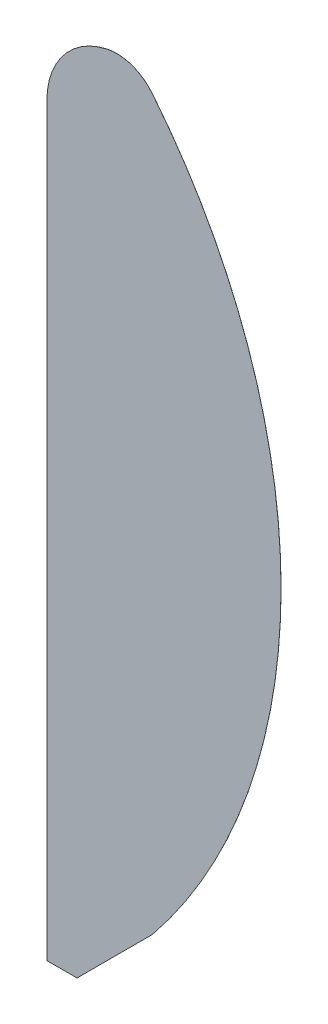
ISO-10303-21;
HEADER;
FILE_DESCRIPTION(('STEP AP214'),'2;1');
FILE_NAME('part.step','',(''),(''),'','','');
FILE_SCHEMA(('AUTOMOTIVE_DESIGN { 1 0 10303 214 1 1 1 1 }'));
ENDSEC;
DATA;
#1=APPLICATION_CONTEXT('core data for automotive mechanical design processes');
#2=APPLICATION_PROTOCOL_DEFINITION('international standard','automotive_design',2000,#1);
#3=PRODUCT_CONTEXT('',#1,'mechanical');
#4=PRODUCT('Part','Part','',(#3));
#5=PRODUCT_RELATED_PRODUCT_CATEGORY('part','',(#4));
#6=PRODUCT_DEFINITION_FORMATION('','',#4);
#7=PRODUCT_DEFINITION_CONTEXT('part definition',#1,'design');
#8=PRODUCT_DEFINITION('design','',#6,#7);
#9=PRODUCT_DEFINITION_SHAPE('','',#8);
#10=(LENGTH_UNIT() NAMED_UNIT(*) SI_UNIT(.MILLI.,.METRE.));
#11=(NAMED_UNIT(*) PLANE_ANGLE_UNIT() SI_UNIT($,.RADIAN.));
#12=(NAMED_UNIT(*) SI_UNIT($,.STERADIAN.) SOLID_ANGLE_UNIT());
#13=UNCERTAINTY_MEASURE_WITH_UNIT(LENGTH_MEASURE(1.E-05),#10,'distance_accuracy_value','');
#14=(GEOMETRIC_REPRESENTATION_CONTEXT(3) GLOBAL_UNCERTAINTY_ASSIGNED_CONTEXT((#13)) GLOBAL_UNIT_ASSIGNED_CONTEXT((#10,
#11,#12)) REPRESENTATION_CONTEXT('',''));
#15=CARTESIAN_POINT('',(0.,0.,0.));
#16=DIRECTION('',(0.,0.,1.));
#17=DIRECTION('',(1.,0.,0.));
#18=AXIS2_PLACEMENT_3D('',#15,#16,#17);
#19=CARTESIAN_POINT('',(0.,0.,0.01));
#20=DIRECTION('',(0.,1.,0.));
#21=DIRECTION('',(-1.,0.,0.));
#22=AXIS2_PLACEMENT_3D('',#19,#20,#21);
#23=PLANE('',#22);
#24=DIRECTION('',(1.,0.,0.));
#25=VECTOR('',#24,1.);
#26=CARTESIAN_POINT('',(0.,0.,0.));
#27=LINE('',#26,#25);
#28=CARTESIAN_POINT('',(0.,0.,0.));
#29=VERTEX_POINT('',#28);
#30=CARTESIAN_POINT('',(5.,0.,0.));
#31=VERTEX_POINT('',#30);
#32=EDGE_CURVE('E122',#29,#31,#27,.T.);
#33=ORIENTED_EDGE('',*,*,#32,.T.);
#34=DIRECTION('',(0.,0.,-1.));
#35=VECTOR('',#34,1.);
#36=CARTESIAN_POINT('',(5.,0.,0.01));
#37=LINE('',#36,#35);
#38=CARTESIAN_POINT('',(5.,0.,0.01));
#39=VERTEX_POINT('',#38);
#40=EDGE_CURVE('E11',#39,#31,#37,.T.);
#41=ORIENTED_EDGE('',*,*,#40,.F.);
#42=DIRECTION('',(1.,0.,0.));
#43=VECTOR('',#42,1.);
#44=CARTESIAN_POINT('',(0.,0.,0.01));
#45=LINE('',#44,#43);
#46=CARTESIAN_POINT('',(0.,0.,0.01));
#47=VERTEX_POINT('',#46);
#48=EDGE_CURVE('E136',#47,#39,#45,.T.);
#49=ORIENTED_EDGE('',*,*,#48,.F.);
#50=DIRECTION('',(0.,0.,-1.));
#51=VECTOR('',#50,1.);
#52=CARTESIAN_POINT('',(0.,0.,0.01));
#53=LINE('',#52,#51);
#54=EDGE_CURVE('E54',#47,#29,#53,.T.);
#55=ORIENTED_EDGE('',*,*,#54,.T.);
#56=EDGE_LOOP('',(#33,#41,#49,#55));
#57=FACE_BOUND('',#56,.T.);
#58=ADVANCED_FACE('F39',(#57),#23,.F.);
#59=CARTESIAN_POINT('',(5.,0.,0.01));
#60=DIRECTION('',(-0.707106781186547,0.707106781186547,0.));
#61=DIRECTION('',(-0.707106781186548,-0.707106781186548,0.));
#62=AXIS2_PLACEMENT_3D('',#59,#60,#61);
#63=PLANE('',#62);
#64=DIRECTION('',(0.707106781186547,0.707106781186547,0.));
#65=VECTOR('',#64,1.);
#66=CARTESIAN_POINT('',(5.,0.,0.));
#67=LINE('',#66,#65);
#68=CARTESIAN_POINT('',(17.5,12.5,0.));
#69=VERTEX_POINT('',#68);
#70=EDGE_CURVE('E124',#31,#69,#67,.T.);
#71=ORIENTED_EDGE('',*,*,#70,.T.);
#72=DIRECTION('',(0.,0.,-1.));
#73=VECTOR('',#72,1.);
#74=CARTESIAN_POINT('',(17.5,12.5,0.01));
#75=LINE('',#74,#73);
#76=CARTESIAN_POINT('',(17.5,12.5,0.01));
#77=VERTEX_POINT('',#76);
#78=EDGE_CURVE('E50',#77,#69,#75,.T.);
#79=ORIENTED_EDGE('',*,*,#78,.F.);
#80=DIRECTION('',(0.707106781186547,0.707106781186547,0.));
#81=VECTOR('',#80,1.);
#82=CARTESIAN_POINT('',(5.,0.,0.01));
#83=LINE('',#82,#81);
#84=EDGE_CURVE('E87',#39,#77,#83,.T.);
#85=ORIENTED_EDGE('',*,*,#84,.F.);
#86=ORIENTED_EDGE('',*,*,#40,.T.);
#87=EDGE_LOOP('',(#71,#79,#85,#86));
#88=FACE_BOUND('',#87,.T.);
#89=ADVANCED_FACE('F156',(#88),#63,.F.);
#90=CARTESIAN_POINT('',(-57.2979556482088,72.9240746674905,0.01));
#91=DIRECTION('',(0.,0.,-1.));
#92=DIRECTION('',(-1.,0.,0.));
#93=AXIS2_PLACEMENT_3D('',#90,#91,#92);
#94=CYLINDRICAL_SURFACE('',#93,96.1550985053516);
#95=CARTESIAN_POINT('',(-57.2979556482088,72.9240746674905,0.));
#96=DIRECTION('',(0.,0.,1.));
#97=DIRECTION('',(1.,0.,0.));
#98=AXIS2_PLACEMENT_3D('',#95,#96,#97);
#99=CIRCLE('',#98,96.1550985053516);
#100=CARTESIAN_POINT('',(17.5,133.348149334981,0.));
#101=VERTEX_POINT('',#100);
#102=EDGE_CURVE('E130',#69,#101,#99,.T.);
#103=ORIENTED_EDGE('',*,*,#102,.T.);
#104=DIRECTION('',(0.,0.,-1.));
#105=VECTOR('',#104,1.);
#106=CARTESIAN_POINT('',(17.5,133.348149334981,0.01));
#107=LINE('',#106,#105);
#108=CARTESIAN_POINT('',(17.5,133.348149334981,0.01));
#109=VERTEX_POINT('',#108);
#110=EDGE_CURVE('E106',#109,#101,#107,.T.);
#111=ORIENTED_EDGE('',*,*,#110,.F.);
#112=CARTESIAN_POINT('',(-57.2979556482088,72.9240746674905,0.01));
#113=DIRECTION('',(0.,0.,1.));
#114=DIRECTION('',(1.,0.,0.));
#115=AXIS2_PLACEMENT_3D('',#112,#113,#114);
#116=CIRCLE('',#115,96.1550985053516);
#117=EDGE_CURVE('E111',#77,#109,#116,.T.);
#118=ORIENTED_EDGE('',*,*,#117,.F.);
#119=ORIENTED_EDGE('',*,*,#78,.T.);
#120=EDGE_LOOP('',(#103,#111,#118,#119));
#121=FACE_BOUND('',#120,.T.);
#122=ADVANCED_FACE('F142',(#121),#94,.T.);
#123=CARTESIAN_POINT('',(11.5943245850789,128.577364236101,0.01));
#124=DIRECTION('',(0.,0.,-1.));
#125=DIRECTION('',(-1.,0.,0.));
#126=AXIS2_PLACEMENT_3D('',#123,#124,#125);
#127=CYLINDRICAL_SURFACE('',#126,7.59192943632236);
#128=CARTESIAN_POINT('',(11.5943245850789,128.577364236101,0.));
#129=DIRECTION('',(0.,0.,-1.));
#130=DIRECTION('',(-1.,0.,0.));
#131=AXIS2_PLACEMENT_3D('',#128,#129,#130);
#132=CIRCLE('',#131,7.59192943632236);
#133=CARTESIAN_POINT('',(10.,136.,0.));
#134=VERTEX_POINT('',#133);
#135=EDGE_CURVE('E105',#134,#101,#132,.T.);
#136=ORIENTED_EDGE('',*,*,#135,.F.);
#137=DIRECTION('',(0.,0.,-1.));
#138=VECTOR('',#137,1.);
#139=CARTESIAN_POINT('',(10.,136.,0.01));
#140=LINE('',#139,#138);
#141=CARTESIAN_POINT('',(10.,136.,0.01));
#142=VERTEX_POINT('',#141);
#143=EDGE_CURVE('E100',#142,#134,#140,.T.);
#144=ORIENTED_EDGE('',*,*,#143,.F.);
#145=CARTESIAN_POINT('',(11.5943245850789,128.577364236101,0.01));
#146=DIRECTION('',(0.,0.,-1.));
#147=DIRECTION('',(-1.,0.,0.));
#148=AXIS2_PLACEMENT_3D('',#145,#146,#147);
#149=CIRCLE('',#148,7.59192943632236);
#150=EDGE_CURVE('E99',#142,#109,#149,.T.);
#151=ORIENTED_EDGE('',*,*,#150,.T.);
#152=ORIENTED_EDGE('',*,*,#110,.T.);
#153=EDGE_LOOP('',(#136,#144,#151,#152));
#154=FACE_BOUND('',#153,.T.);
#155=ADVANCED_FACE('F97',(#154),#127,.T.);
#156=CARTESIAN_POINT('',(12.6582688,123.624,0.01));
#157=DIRECTION('',(0.,0.,-1.));
#158=DIRECTION('',(-1.,0.,0.));
#159=AXIS2_PLACEMENT_3D('',#156,#157,#158);
#160=CYLINDRICAL_SURFACE('',#159,12.6582688);
#161=CARTESIAN_POINT('',(12.6582688,123.624,0.));
#162=DIRECTION('',(0.,0.,-1.));
#163=DIRECTION('',(-1.,0.,0.));
#164=AXIS2_PLACEMENT_3D('',#161,#162,#163);
#165=CIRCLE('',#164,12.6582688);
#166=CARTESIAN_POINT('',(0.,123.624,0.));
#167=VERTEX_POINT('',#166);
#168=EDGE_CURVE('E134',#167,#134,#165,.T.);
#169=ORIENTED_EDGE('',*,*,#168,.F.);
#170=DIRECTION('',(0.,0.,-1.));
#171=VECTOR('',#170,1.);
#172=CARTESIAN_POINT('',(0.,123.624,0.01));
#173=LINE('',#172,#171);
#174=CARTESIAN_POINT('',(0.,123.624,0.01));
#175=VERTEX_POINT('',#174);
#176=EDGE_CURVE('E73',#175,#167,#173,.T.);
#177=ORIENTED_EDGE('',*,*,#176,.F.);
#178=CARTESIAN_POINT('',(12.6582688,123.624,0.01));
#179=DIRECTION('',(0.,0.,-1.));
#180=DIRECTION('',(-1.,0.,0.));
#181=AXIS2_PLACEMENT_3D('',#178,#179,#180);
#182=CIRCLE('',#181,12.6582688);
#183=EDGE_CURVE('E115',#175,#142,#182,.T.);
#184=ORIENTED_EDGE('',*,*,#183,.T.);
#185=ORIENTED_EDGE('',*,*,#143,.T.);
#186=EDGE_LOOP('',(#169,#177,#184,#185));
#187=FACE_BOUND('',#186,.T.);
#188=ADVANCED_FACE('F116',(#187),#160,.T.);
#189=CARTESIAN_POINT('',(0.,0.,0.01));
#190=DIRECTION('',(-1.,0.,0.));
#191=DIRECTION('',(0.,-1.,0.));
#192=AXIS2_PLACEMENT_3D('',#189,#190,#191);
#193=PLANE('',#192);
#194=DIRECTION('',(0.,1.,0.));
#195=VECTOR('',#194,1.);
#196=CARTESIAN_POINT('',(0.,0.,0.));
#197=LINE('',#196,#195);
#198=EDGE_CURVE('E135',#29,#167,#197,.T.);
#199=ORIENTED_EDGE('',*,*,#198,.F.);
#200=ORIENTED_EDGE('',*,*,#54,.F.);
#201=DIRECTION('',(0.,1.,0.));
#202=VECTOR('',#201,1.);
#203=CARTESIAN_POINT('',(0.,0.,0.01));
#204=LINE('',#203,#202);
#205=EDGE_CURVE('E120',#47,#175,#204,.T.);
#206=ORIENTED_EDGE('',*,*,#205,.T.);
#207=ORIENTED_EDGE('',*,*,#176,.T.);
#208=EDGE_LOOP('',(#199,#200,#206,#207));
#209=FACE_BOUND('',#208,.T.);
#210=ADVANCED_FACE('F144',(#209),#193,.T.);
#211=CARTESIAN_POINT('',(-57.2979556482088,72.9240746674905,0.01));
#212=DIRECTION('',(0.,0.,1.));
#213=DIRECTION('',(1.,0.,0.));
#214=AXIS2_PLACEMENT_3D('',#211,#212,#213);
#215=PLANE('',#214);
#216=ORIENTED_EDGE('',*,*,#48,.T.);
#217=ORIENTED_EDGE('',*,*,#84,.T.);
#218=ORIENTED_EDGE('',*,*,#117,.T.);
#219=ORIENTED_EDGE('',*,*,#150,.F.);
#220=ORIENTED_EDGE('',*,*,#183,.F.);
#221=ORIENTED_EDGE('',*,*,#205,.F.);
#222=EDGE_LOOP('',(#216,#217,#218,#219,#220,#221));
#223=FACE_BOUND('',#222,.T.);
#224=ADVANCED_FACE('F109',(#223),#215,.T.);
#225=CARTESIAN_POINT('',(-57.2979556482088,72.9240746674905,0.));
#226=DIRECTION('',(0.,0.,1.));
#227=DIRECTION('',(1.,0.,0.));
#228=AXIS2_PLACEMENT_3D('',#225,#226,#227);
#229=PLANE('',#228);
#230=ORIENTED_EDGE('',*,*,#32,.F.);
#231=ORIENTED_EDGE('',*,*,#198,.T.);
#232=ORIENTED_EDGE('',*,*,#168,.T.);
#233=ORIENTED_EDGE('',*,*,#135,.T.);
#234=ORIENTED_EDGE('',*,*,#102,.F.);
#235=ORIENTED_EDGE('',*,*,#70,.F.);
#236=EDGE_LOOP('',(#230,#231,#232,#233,#234,#235));
#237=FACE_BOUND('',#236,.T.);
#238=ADVANCED_FACE('F145',(#237),#229,.F.);
#239=CLOSED_SHELL('',(#58,#89,#122,#155,#188,#210,#224,#238));
#240=MANIFOLD_SOLID_BREP('B2',#239);
#241=ADVANCED_BREP_SHAPE_REPRESENTATION('',(#18,#240),#14);
#242=SHAPE_DEFINITION_REPRESENTATION(#9,#241);
ENDSEC;
END-ISO-10303-21;
